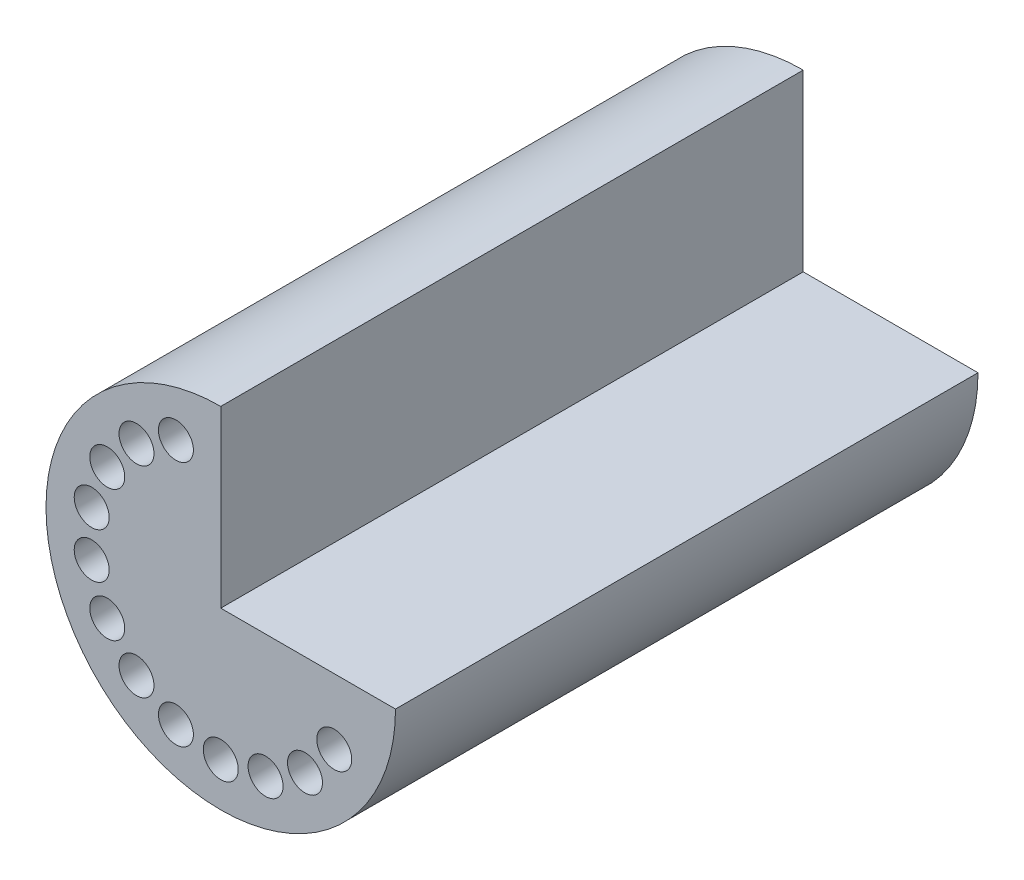
ISO-10303-21;
HEADER;
FILE_DESCRIPTION(('STEP AP214'),'2;1');
FILE_NAME('part.step','',(''),(''),'','','');
FILE_SCHEMA(('AUTOMOTIVE_DESIGN { 1 0 10303 214 1 1 1 1 }'));
ENDSEC;
DATA;
#1=APPLICATION_CONTEXT('core data for automotive mechanical design processes');
#2=APPLICATION_PROTOCOL_DEFINITION('international standard','automotive_design',2000,#1);
#3=PRODUCT_CONTEXT('',#1,'mechanical');
#4=PRODUCT('Part','Part','',(#3));
#5=PRODUCT_RELATED_PRODUCT_CATEGORY('part','',(#4));
#6=PRODUCT_DEFINITION_FORMATION('','',#4);
#7=PRODUCT_DEFINITION_CONTEXT('part definition',#1,'design');
#8=PRODUCT_DEFINITION('design','',#6,#7);
#9=PRODUCT_DEFINITION_SHAPE('','',#8);
#10=(LENGTH_UNIT() NAMED_UNIT(*) SI_UNIT(.MILLI.,.METRE.));
#11=(NAMED_UNIT(*) PLANE_ANGLE_UNIT() SI_UNIT($,.RADIAN.));
#12=(NAMED_UNIT(*) SI_UNIT($,.STERADIAN.) SOLID_ANGLE_UNIT());
#13=UNCERTAINTY_MEASURE_WITH_UNIT(LENGTH_MEASURE(1.E-05),#10,'distance_accuracy_value','');
#14=(GEOMETRIC_REPRESENTATION_CONTEXT(3) GLOBAL_UNCERTAINTY_ASSIGNED_CONTEXT((#13)) GLOBAL_UNIT_ASSIGNED_CONTEXT((#10,
#11,#12)) REPRESENTATION_CONTEXT('',''));
#15=CARTESIAN_POINT('',(0.,0.,0.));
#16=DIRECTION('',(0.,0.,1.));
#17=DIRECTION('',(1.,0.,0.));
#18=AXIS2_PLACEMENT_3D('',#15,#16,#17);
#19=CARTESIAN_POINT('',(0.,0.,-500.));
#20=DIRECTION('',(0.,0.,1.));
#21=DIRECTION('',(1.,0.,0.));
#22=AXIS2_PLACEMENT_3D('',#19,#20,#21);
#23=CYLINDRICAL_SURFACE('',#22,150.);
#24=CARTESIAN_POINT('',(0.,0.,0.));
#25=DIRECTION('',(0.,0.,1.));
#26=DIRECTION('',(1.,0.,0.));
#27=AXIS2_PLACEMENT_3D('',#24,#25,#26);
#28=CIRCLE('',#27,150.);
#29=CARTESIAN_POINT('',(0.,150.,0.));
#30=VERTEX_POINT('',#29);
#31=CARTESIAN_POINT('',(150.,0.,0.));
#32=VERTEX_POINT('',#31);
#33=EDGE_CURVE('E37',#30,#32,#28,.T.);
#34=ORIENTED_EDGE('',*,*,#33,.F.);
#35=DIRECTION('',(0.,0.,1.));
#36=VECTOR('',#35,1.);
#37=CARTESIAN_POINT('',(0.,150.,-500.));
#38=LINE('',#37,#36);
#39=CARTESIAN_POINT('',(0.,150.,-500.));
#40=VERTEX_POINT('',#39);
#41=EDGE_CURVE('E64',#40,#30,#38,.T.);
#42=ORIENTED_EDGE('',*,*,#41,.F.);
#43=CARTESIAN_POINT('',(0.,0.,-500.));
#44=DIRECTION('',(0.,0.,1.));
#45=DIRECTION('',(1.,0.,0.));
#46=AXIS2_PLACEMENT_3D('',#43,#44,#45);
#47=CIRCLE('',#46,150.);
#48=CARTESIAN_POINT('',(150.,0.,-500.));
#49=VERTEX_POINT('',#48);
#50=EDGE_CURVE('E11',#40,#49,#47,.T.);
#51=ORIENTED_EDGE('',*,*,#50,.T.);
#52=DIRECTION('',(0.,0.,1.));
#53=VECTOR('',#52,1.);
#54=CARTESIAN_POINT('',(150.,0.,-500.));
#55=LINE('',#54,#53);
#56=EDGE_CURVE('E70',#49,#32,#55,.T.);
#57=ORIENTED_EDGE('',*,*,#56,.T.);
#58=EDGE_LOOP('',(#34,#42,#51,#57));
#59=FACE_BOUND('',#58,.T.);
#60=ADVANCED_FACE('F34',(#59),#23,.T.);
#61=CARTESIAN_POINT('',(0.,0.,-500.));
#62=DIRECTION('',(0.,0.,1.));
#63=DIRECTION('',(1.,0.,0.));
#64=AXIS2_PLACEMENT_3D('',#61,#62,#63);
#65=PLANE('',#64);
#66=CARTESIAN_POINT('',(97.4278579257496,-56.2499999999996,-500.));
#67=DIRECTION('',(0.,0.,1.));
#68=DIRECTION('',(-0.766044443118971,-0.642787609686547,0.));
#69=AXIS2_PLACEMENT_3D('',#66,#67,#68);
#70=CIRCLE('',#69,15.);
#71=CARTESIAN_POINT('',(85.937191278965,-65.8918141452978,-500.));
#72=VERTEX_POINT('',#71);
#73=EDGE_CURVE('E331',#72,#72,#70,.T.);
#74=ORIENTED_EDGE('',*,*,#73,.T.);
#75=EDGE_LOOP('',(#74));
#76=FACE_BOUND('',#75,.T.);
#77=CARTESIAN_POINT('',(72.3136060897359,-86.1799998508848,-500.));
#78=DIRECTION('',(0.,0.,1.));
#79=DIRECTION('',(-0.939692620785905,-0.342020143325677,0.));
#80=AXIS2_PLACEMENT_3D('',#77,#78,#79);
#81=CIRCLE('',#80,15.);
#82=CARTESIAN_POINT('',(58.2182167779474,-91.31030200077,-500.));
#83=VERTEX_POINT('',#82);
#84=EDGE_CURVE('E325',#83,#83,#81,.T.);
#85=ORIENTED_EDGE('',*,*,#84,.T.);
#86=EDGE_LOOP('',(#85));
#87=FACE_BOUND('',#86,.T.);
#88=CARTESIAN_POINT('',(38.4772661241371,-105.715419838415,-500.));
#89=DIRECTION('',(0.,0.,1.));
#90=DIRECTION('',(-1.,0.,0.));
#91=AXIS2_PLACEMENT_3D('',#88,#89,#90);
#92=CIRCLE('',#91,15.);
#93=CARTESIAN_POINT('',(23.4772661241371,-105.715419838415,-500.));
#94=VERTEX_POINT('',#93);
#95=EDGE_CURVE('E319',#94,#94,#92,.T.);
#96=ORIENTED_EDGE('',*,*,#95,.T.);
#97=EDGE_LOOP('',(#96));
#98=FACE_BOUND('',#97,.T.);
#99=CARTESIAN_POINT('',(1.45716771982052E-13,-112.5,-500.));
#100=DIRECTION('',(0.,0.,1.));
#101=DIRECTION('',(-0.939692620785911,0.342020143325662,0.));
#102=AXIS2_PLACEMENT_3D('',#99,#100,#101);
#103=CIRCLE('',#102,15.);
#104=CARTESIAN_POINT('',(-14.0953893117885,-107.369697850115,-500.));
#105=VERTEX_POINT('',#104);
#106=EDGE_CURVE('E313',#105,#105,#103,.T.);
#107=ORIENTED_EDGE('',*,*,#106,.T.);
#108=EDGE_LOOP('',(#107));
#109=FACE_BOUND('',#108,.T.);
#110=CARTESIAN_POINT('',(-38.4772661241377,-105.715419838415,-500.));
#111=DIRECTION('',(0.,0.,1.));
#112=DIRECTION('',(-0.766044443118982,0.642787609686534,0.));
#113=AXIS2_PLACEMENT_3D('',#110,#111,#112);
#114=CIRCLE('',#113,15.);
#115=CARTESIAN_POINT('',(-49.9679327709224,-96.0736056931167,-500.));
#116=VERTEX_POINT('',#115);
#117=EDGE_CURVE('E307',#116,#116,#114,.T.);
#118=ORIENTED_EDGE('',*,*,#117,.T.);
#119=EDGE_LOOP('',(#118));
#120=FACE_BOUND('',#119,.T.);
#121=CARTESIAN_POINT('',(-72.3136060897357,-86.179999850885,-500.));
#122=DIRECTION('',(0.,0.,1.));
#123=DIRECTION('',(-0.500000000000005,0.866025403784436,0.));
#124=AXIS2_PLACEMENT_3D('',#121,#122,#123);
#125=CIRCLE('',#124,15.);
#126=CARTESIAN_POINT('',(-79.8136060897358,-73.1896187941185,-500.));
#127=VERTEX_POINT('',#126);
#128=EDGE_CURVE('E301',#127,#127,#125,.T.);
#129=ORIENTED_EDGE('',*,*,#128,.T.);
#130=EDGE_LOOP('',(#129));
#131=FACE_BOUND('',#130,.T.);
#132=CARTESIAN_POINT('',(-97.4278579257494,-56.2499999999999,-500.));
#133=DIRECTION('',(0.,0.,1.));
#134=DIRECTION('',(-0.173648177666935,0.984807753012207,0.));
#135=AXIS2_PLACEMENT_3D('',#132,#133,#134);
#136=CIRCLE('',#135,15.);
#137=CARTESIAN_POINT('',(-100.032580590753,-41.4778837048168,-500.));
#138=VERTEX_POINT('',#137);
#139=EDGE_CURVE('E295',#138,#138,#136,.T.);
#140=ORIENTED_EDGE('',*,*,#139,.T.);
#141=EDGE_LOOP('',(#140));
#142=FACE_BOUND('',#141,.T.);
#143=CARTESIAN_POINT('',(-110.790872213873,-19.5354199875294,-500.));
#144=DIRECTION('',(0.,0.,1.));
#145=DIRECTION('',(0.173648177666927,0.984807753012209,0.));
#146=AXIS2_PLACEMENT_3D('',#143,#144,#145);
#147=CIRCLE('',#146,15.);
#148=CARTESIAN_POINT('',(-108.18614954887,-4.76330369234627,-500.));
#149=VERTEX_POINT('',#148);
#150=EDGE_CURVE('E289',#149,#149,#147,.T.);
#151=ORIENTED_EDGE('',*,*,#150,.T.);
#152=EDGE_LOOP('',(#151));
#153=FACE_BOUND('',#152,.T.);
#154=CARTESIAN_POINT('',(-110.790872213873,19.53541998753,-500.));
#155=DIRECTION('',(0.,0.,1.));
#156=DIRECTION('',(0.499999999999998,0.86602540378444,0.));
#157=AXIS2_PLACEMENT_3D('',#154,#155,#156);
#158=CIRCLE('',#157,15.);
#159=CARTESIAN_POINT('',(-103.290872213873,32.5258010442966,-500.));
#160=VERTEX_POINT('',#159);
#161=EDGE_CURVE('E283',#160,#160,#158,.T.);
#162=ORIENTED_EDGE('',*,*,#161,.T.);
#163=EDGE_LOOP('',(#162));
#164=FACE_BOUND('',#163,.T.);
#165=CARTESIAN_POINT('',(-97.4278579257491,56.2500000000004,-500.));
#166=DIRECTION('',(0.,0.,1.));
#167=DIRECTION('',(0.766044443118977,0.642787609686541,0.));
#168=AXIS2_PLACEMENT_3D('',#165,#166,#167);
#169=CIRCLE('',#168,15.);
#170=CARTESIAN_POINT('',(-85.9371912789644,65.8918141452985,-500.));
#171=VERTEX_POINT('',#170);
#172=EDGE_CURVE('E277',#171,#171,#169,.T.);
#173=ORIENTED_EDGE('',*,*,#172,.T.);
#174=EDGE_LOOP('',(#173));
#175=FACE_BOUND('',#174,.T.);
#176=CARTESIAN_POINT('',(-72.3136060897352,86.1799998508854,-500.));
#177=DIRECTION('',(0.,0.,1.));
#178=DIRECTION('',(0.939692620785908,0.34202014332567,0.));
#179=AXIS2_PLACEMENT_3D('',#176,#177,#178);
#180=CIRCLE('',#179,15.);
#181=CARTESIAN_POINT('',(-58.2182167779466,91.3103020007704,-500.));
#182=VERTEX_POINT('',#181);
#183=EDGE_CURVE('E267',#182,#182,#180,.T.);
#184=ORIENTED_EDGE('',*,*,#183,.T.);
#185=EDGE_LOOP('',(#184));
#186=FACE_BOUND('',#185,.T.);
#187=CARTESIAN_POINT('',(-38.4772661241371,105.715419838415,-500.));
#188=DIRECTION('',(0.,0.,1.));
#189=DIRECTION('',(1.,0.,0.));
#190=AXIS2_PLACEMENT_3D('',#187,#188,#189);
#191=CIRCLE('',#190,15.);
#192=CARTESIAN_POINT('',(-23.4772661241371,105.715419838415,-500.));
#193=VERTEX_POINT('',#192);
#194=EDGE_CURVE('E87',#193,#193,#191,.T.);
#195=ORIENTED_EDGE('',*,*,#194,.T.);
#196=EDGE_LOOP('',(#195));
#197=FACE_BOUND('',#196,.T.);
#198=ORIENTED_EDGE('',*,*,#50,.F.);
#199=DIRECTION('',(0.,-1.,0.));
#200=VECTOR('',#199,1.);
#201=CARTESIAN_POINT('',(0.,0.,-500.));
#202=LINE('',#201,#200);
#203=CARTESIAN_POINT('',(0.,0.,-500.));
#204=VERTEX_POINT('',#203);
#205=EDGE_CURVE('E54',#40,#204,#202,.T.);
#206=ORIENTED_EDGE('',*,*,#205,.T.);
#207=DIRECTION('',(1.,0.,0.));
#208=VECTOR('',#207,1.);
#209=CARTESIAN_POINT('',(0.,0.,-500.));
#210=LINE('',#209,#208);
#211=EDGE_CURVE('E71',#204,#49,#210,.T.);
#212=ORIENTED_EDGE('',*,*,#211,.T.);
#213=EDGE_LOOP('',(#198,#206,#212));
#214=FACE_BOUND('',#213,.T.);
#215=ADVANCED_FACE('F79',(#76,#87,#98,#109,#120,#131,#142,#153,#164,#175,#186,#197,#214),#65,.F.);
#216=CARTESIAN_POINT('',(0.,0.,0.));
#217=DIRECTION('',(0.,0.,1.));
#218=DIRECTION('',(1.,0.,0.));
#219=AXIS2_PLACEMENT_3D('',#216,#217,#218);
#220=PLANE('',#219);
#221=CARTESIAN_POINT('',(97.4278579257496,-56.2499999999996,0.));
#222=DIRECTION('',(0.,0.,1.));
#223=DIRECTION('',(-0.766044443118971,-0.642787609686547,0.));
#224=AXIS2_PLACEMENT_3D('',#221,#222,#223);
#225=CIRCLE('',#224,15.);
#226=CARTESIAN_POINT('',(85.937191278965,-65.8918141452978,0.));
#227=VERTEX_POINT('',#226);
#228=EDGE_CURVE('E328',#227,#227,#225,.T.);
#229=ORIENTED_EDGE('',*,*,#228,.F.);
#230=EDGE_LOOP('',(#229));
#231=FACE_BOUND('',#230,.T.);
#232=CARTESIAN_POINT('',(72.3136060897359,-86.1799998508848,0.));
#233=DIRECTION('',(0.,0.,1.));
#234=DIRECTION('',(-0.939692620785905,-0.342020143325677,0.));
#235=AXIS2_PLACEMENT_3D('',#232,#233,#234);
#236=CIRCLE('',#235,15.);
#237=CARTESIAN_POINT('',(58.2182167779474,-91.31030200077,0.));
#238=VERTEX_POINT('',#237);
#239=EDGE_CURVE('E322',#238,#238,#236,.T.);
#240=ORIENTED_EDGE('',*,*,#239,.F.);
#241=EDGE_LOOP('',(#240));
#242=FACE_BOUND('',#241,.T.);
#243=CARTESIAN_POINT('',(38.4772661241371,-105.715419838415,0.));
#244=DIRECTION('',(0.,0.,1.));
#245=DIRECTION('',(-1.,0.,0.));
#246=AXIS2_PLACEMENT_3D('',#243,#244,#245);
#247=CIRCLE('',#246,15.);
#248=CARTESIAN_POINT('',(23.4772661241371,-105.715419838415,0.));
#249=VERTEX_POINT('',#248);
#250=EDGE_CURVE('E316',#249,#249,#247,.T.);
#251=ORIENTED_EDGE('',*,*,#250,.F.);
#252=EDGE_LOOP('',(#251));
#253=FACE_BOUND('',#252,.T.);
#254=CARTESIAN_POINT('',(1.45716771982052E-13,-112.5,0.));
#255=DIRECTION('',(0.,0.,1.));
#256=DIRECTION('',(-0.939692620785911,0.342020143325662,0.));
#257=AXIS2_PLACEMENT_3D('',#254,#255,#256);
#258=CIRCLE('',#257,15.);
#259=CARTESIAN_POINT('',(-14.0953893117885,-107.369697850115,0.));
#260=VERTEX_POINT('',#259);
#261=EDGE_CURVE('E310',#260,#260,#258,.T.);
#262=ORIENTED_EDGE('',*,*,#261,.F.);
#263=EDGE_LOOP('',(#262));
#264=FACE_BOUND('',#263,.T.);
#265=CARTESIAN_POINT('',(-38.4772661241377,-105.715419838415,0.));
#266=DIRECTION('',(0.,0.,1.));
#267=DIRECTION('',(-0.766044443118982,0.642787609686534,0.));
#268=AXIS2_PLACEMENT_3D('',#265,#266,#267);
#269=CIRCLE('',#268,15.);
#270=CARTESIAN_POINT('',(-49.9679327709224,-96.0736056931167,0.));
#271=VERTEX_POINT('',#270);
#272=EDGE_CURVE('E304',#271,#271,#269,.T.);
#273=ORIENTED_EDGE('',*,*,#272,.F.);
#274=EDGE_LOOP('',(#273));
#275=FACE_BOUND('',#274,.T.);
#276=CARTESIAN_POINT('',(-72.3136060897357,-86.179999850885,0.));
#277=DIRECTION('',(0.,0.,1.));
#278=DIRECTION('',(-0.500000000000005,0.866025403784436,0.));
#279=AXIS2_PLACEMENT_3D('',#276,#277,#278);
#280=CIRCLE('',#279,15.);
#281=CARTESIAN_POINT('',(-79.8136060897358,-73.1896187941185,0.));
#282=VERTEX_POINT('',#281);
#283=EDGE_CURVE('E298',#282,#282,#280,.T.);
#284=ORIENTED_EDGE('',*,*,#283,.F.);
#285=EDGE_LOOP('',(#284));
#286=FACE_BOUND('',#285,.T.);
#287=CARTESIAN_POINT('',(-97.4278579257494,-56.2499999999999,0.));
#288=DIRECTION('',(0.,0.,1.));
#289=DIRECTION('',(-0.173648177666935,0.984807753012207,0.));
#290=AXIS2_PLACEMENT_3D('',#287,#288,#289);
#291=CIRCLE('',#290,15.);
#292=CARTESIAN_POINT('',(-100.032580590753,-41.4778837048168,0.));
#293=VERTEX_POINT('',#292);
#294=EDGE_CURVE('E292',#293,#293,#291,.T.);
#295=ORIENTED_EDGE('',*,*,#294,.F.);
#296=EDGE_LOOP('',(#295));
#297=FACE_BOUND('',#296,.T.);
#298=CARTESIAN_POINT('',(-110.790872213873,-19.5354199875294,0.));
#299=DIRECTION('',(0.,0.,1.));
#300=DIRECTION('',(0.173648177666927,0.984807753012209,0.));
#301=AXIS2_PLACEMENT_3D('',#298,#299,#300);
#302=CIRCLE('',#301,15.);
#303=CARTESIAN_POINT('',(-108.18614954887,-4.76330369234627,0.));
#304=VERTEX_POINT('',#303);
#305=EDGE_CURVE('E286',#304,#304,#302,.T.);
#306=ORIENTED_EDGE('',*,*,#305,.F.);
#307=EDGE_LOOP('',(#306));
#308=FACE_BOUND('',#307,.T.);
#309=CARTESIAN_POINT('',(-110.790872213873,19.53541998753,0.));
#310=DIRECTION('',(0.,0.,1.));
#311=DIRECTION('',(0.499999999999998,0.86602540378444,0.));
#312=AXIS2_PLACEMENT_3D('',#309,#310,#311);
#313=CIRCLE('',#312,15.);
#314=CARTESIAN_POINT('',(-103.290872213873,32.5258010442966,0.));
#315=VERTEX_POINT('',#314);
#316=EDGE_CURVE('E280',#315,#315,#313,.T.);
#317=ORIENTED_EDGE('',*,*,#316,.F.);
#318=EDGE_LOOP('',(#317));
#319=FACE_BOUND('',#318,.T.);
#320=CARTESIAN_POINT('',(-97.4278579257491,56.2500000000004,0.));
#321=DIRECTION('',(0.,0.,1.));
#322=DIRECTION('',(0.766044443118977,0.642787609686541,0.));
#323=AXIS2_PLACEMENT_3D('',#320,#321,#322);
#324=CIRCLE('',#323,15.);
#325=CARTESIAN_POINT('',(-85.9371912789644,65.8918141452985,0.));
#326=VERTEX_POINT('',#325);
#327=EDGE_CURVE('E272',#326,#326,#324,.T.);
#328=ORIENTED_EDGE('',*,*,#327,.F.);
#329=EDGE_LOOP('',(#328));
#330=FACE_BOUND('',#329,.T.);
#331=CARTESIAN_POINT('',(-72.3136060897352,86.1799998508854,0.));
#332=DIRECTION('',(0.,0.,1.));
#333=DIRECTION('',(0.939692620785908,0.34202014332567,0.));
#334=AXIS2_PLACEMENT_3D('',#331,#332,#333);
#335=CIRCLE('',#334,15.);
#336=CARTESIAN_POINT('',(-58.2182167779466,91.3103020007704,0.));
#337=VERTEX_POINT('',#336);
#338=EDGE_CURVE('E265',#337,#337,#335,.T.);
#339=ORIENTED_EDGE('',*,*,#338,.F.);
#340=EDGE_LOOP('',(#339));
#341=FACE_BOUND('',#340,.T.);
#342=CARTESIAN_POINT('',(-38.4772661241371,105.715419838415,0.));
#343=DIRECTION('',(0.,0.,1.));
#344=DIRECTION('',(1.,0.,0.));
#345=AXIS2_PLACEMENT_3D('',#342,#343,#344);
#346=CIRCLE('',#345,15.);
#347=CARTESIAN_POINT('',(-23.4772661241371,105.715419838415,0.));
#348=VERTEX_POINT('',#347);
#349=EDGE_CURVE('E84',#348,#348,#346,.T.);
#350=ORIENTED_EDGE('',*,*,#349,.F.);
#351=EDGE_LOOP('',(#350));
#352=FACE_BOUND('',#351,.T.);
#353=DIRECTION('',(0.,-1.,0.));
#354=VECTOR('',#353,1.);
#355=CARTESIAN_POINT('',(0.,0.,0.));
#356=LINE('',#355,#354);
#357=CARTESIAN_POINT('',(0.,0.,0.));
#358=VERTEX_POINT('',#357);
#359=EDGE_CURVE('E48',#30,#358,#356,.T.);
#360=ORIENTED_EDGE('',*,*,#359,.F.);
#361=ORIENTED_EDGE('',*,*,#33,.T.);
#362=DIRECTION('',(1.,0.,0.));
#363=VECTOR('',#362,1.);
#364=CARTESIAN_POINT('',(0.,0.,0.));
#365=LINE('',#364,#363);
#366=EDGE_CURVE('E80',#358,#32,#365,.T.);
#367=ORIENTED_EDGE('',*,*,#366,.F.);
#368=EDGE_LOOP('',(#360,#361,#367));
#369=FACE_BOUND('',#368,.T.);
#370=ADVANCED_FACE('F94',(#231,#242,#253,#264,#275,#286,#297,#308,#319,#330,#341,#352,#369),
#220,.T.);
#371=CARTESIAN_POINT('',(0.,0.,-500.));
#372=DIRECTION('',(-1.,0.,0.));
#373=DIRECTION('',(0.,0.,1.));
#374=AXIS2_PLACEMENT_3D('',#371,#372,#373);
#375=PLANE('',#374);
#376=ORIENTED_EDGE('',*,*,#359,.T.);
#377=DIRECTION('',(0.,0.,1.));
#378=VECTOR('',#377,1.);
#379=CARTESIAN_POINT('',(0.,0.,-500.));
#380=LINE('',#379,#378);
#381=EDGE_CURVE('E65',#204,#358,#380,.T.);
#382=ORIENTED_EDGE('',*,*,#381,.F.);
#383=ORIENTED_EDGE('',*,*,#205,.F.);
#384=ORIENTED_EDGE('',*,*,#41,.T.);
#385=EDGE_LOOP('',(#376,#382,#383,#384));
#386=FACE_BOUND('',#385,.T.);
#387=ADVANCED_FACE('F67',(#386),#375,.F.);
#388=CARTESIAN_POINT('',(0.,0.,-500.));
#389=DIRECTION('',(0.,-1.,0.));
#390=DIRECTION('',(0.,0.,-1.));
#391=AXIS2_PLACEMENT_3D('',#388,#389,#390);
#392=PLANE('',#391);
#393=ORIENTED_EDGE('',*,*,#366,.T.);
#394=ORIENTED_EDGE('',*,*,#56,.F.);
#395=ORIENTED_EDGE('',*,*,#211,.F.);
#396=ORIENTED_EDGE('',*,*,#381,.T.);
#397=EDGE_LOOP('',(#393,#394,#395,#396));
#398=FACE_BOUND('',#397,.T.);
#399=ADVANCED_FACE('F74',(#398),#392,.F.);
#400=CARTESIAN_POINT('',(-38.4772661241371,105.715419838415,-500.));
#401=DIRECTION('',(0.,0.,1.));
#402=DIRECTION('',(1.,0.,0.));
#403=AXIS2_PLACEMENT_3D('',#400,#401,#402);
#404=CYLINDRICAL_SURFACE('',#403,15.);
#405=ORIENTED_EDGE('',*,*,#194,.F.);
#406=EDGE_LOOP('',(#405));
#407=FACE_BOUND('',#406,.T.);
#408=ORIENTED_EDGE('',*,*,#349,.T.);
#409=EDGE_LOOP('',(#408));
#410=FACE_BOUND('',#409,.T.);
#411=ADVANCED_FACE('F120',(#407,#410),#404,.F.);
#412=CARTESIAN_POINT('',(-72.3136060897352,86.1799998508854,-500.));
#413=DIRECTION('',(0.,0.,1.));
#414=DIRECTION('',(0.939692620785908,0.34202014332567,0.));
#415=AXIS2_PLACEMENT_3D('',#412,#413,#414);
#416=CYLINDRICAL_SURFACE('',#415,15.);
#417=ORIENTED_EDGE('',*,*,#183,.F.);
#418=EDGE_LOOP('',(#417));
#419=FACE_BOUND('',#418,.T.);
#420=ORIENTED_EDGE('',*,*,#338,.T.);
#421=EDGE_LOOP('',(#420));
#422=FACE_BOUND('',#421,.T.);
#423=ADVANCED_FACE('F129',(#419,#422),#416,.F.);
#424=CARTESIAN_POINT('',(-97.4278579257491,56.2500000000004,-500.));
#425=DIRECTION('',(0.,0.,1.));
#426=DIRECTION('',(0.766044443118977,0.642787609686541,0.));
#427=AXIS2_PLACEMENT_3D('',#424,#425,#426);
#428=CYLINDRICAL_SURFACE('',#427,15.);
#429=ORIENTED_EDGE('',*,*,#172,.F.);
#430=EDGE_LOOP('',(#429));
#431=FACE_BOUND('',#430,.T.);
#432=ORIENTED_EDGE('',*,*,#327,.T.);
#433=EDGE_LOOP('',(#432));
#434=FACE_BOUND('',#433,.T.);
#435=ADVANCED_FACE('F134',(#431,#434),#428,.F.);
#436=CARTESIAN_POINT('',(-110.790872213873,19.53541998753,-500.));
#437=DIRECTION('',(0.,0.,1.));
#438=DIRECTION('',(0.499999999999998,0.86602540378444,0.));
#439=AXIS2_PLACEMENT_3D('',#436,#437,#438);
#440=CYLINDRICAL_SURFACE('',#439,15.);
#441=ORIENTED_EDGE('',*,*,#161,.F.);
#442=EDGE_LOOP('',(#441));
#443=FACE_BOUND('',#442,.T.);
#444=ORIENTED_EDGE('',*,*,#316,.T.);
#445=EDGE_LOOP('',(#444));
#446=FACE_BOUND('',#445,.T.);
#447=ADVANCED_FACE('F144',(#443,#446),#440,.F.);
#448=CARTESIAN_POINT('',(-110.790872213873,-19.5354199875294,-500.));
#449=DIRECTION('',(0.,0.,1.));
#450=DIRECTION('',(0.173648177666927,0.984807753012209,0.));
#451=AXIS2_PLACEMENT_3D('',#448,#449,#450);
#452=CYLINDRICAL_SURFACE('',#451,15.);
#453=ORIENTED_EDGE('',*,*,#150,.F.);
#454=EDGE_LOOP('',(#453));
#455=FACE_BOUND('',#454,.T.);
#456=ORIENTED_EDGE('',*,*,#305,.T.);
#457=EDGE_LOOP('',(#456));
#458=FACE_BOUND('',#457,.T.);
#459=ADVANCED_FACE('F154',(#455,#458),#452,.F.);
#460=CARTESIAN_POINT('',(-97.4278579257494,-56.2499999999999,-500.));
#461=DIRECTION('',(0.,0.,1.));
#462=DIRECTION('',(-0.173648177666935,0.984807753012207,0.));
#463=AXIS2_PLACEMENT_3D('',#460,#461,#462);
#464=CYLINDRICAL_SURFACE('',#463,15.);
#465=ORIENTED_EDGE('',*,*,#139,.F.);
#466=EDGE_LOOP('',(#465));
#467=FACE_BOUND('',#466,.T.);
#468=ORIENTED_EDGE('',*,*,#294,.T.);
#469=EDGE_LOOP('',(#468));
#470=FACE_BOUND('',#469,.T.);
#471=ADVANCED_FACE('F164',(#467,#470),#464,.F.);
#472=CARTESIAN_POINT('',(-72.3136060897357,-86.179999850885,-500.));
#473=DIRECTION('',(0.,0.,1.));
#474=DIRECTION('',(-0.500000000000005,0.866025403784436,0.));
#475=AXIS2_PLACEMENT_3D('',#472,#473,#474);
#476=CYLINDRICAL_SURFACE('',#475,15.);
#477=ORIENTED_EDGE('',*,*,#128,.F.);
#478=EDGE_LOOP('',(#477));
#479=FACE_BOUND('',#478,.T.);
#480=ORIENTED_EDGE('',*,*,#283,.T.);
#481=EDGE_LOOP('',(#480));
#482=FACE_BOUND('',#481,.T.);
#483=ADVANCED_FACE('F174',(#479,#482),#476,.F.);
#484=CARTESIAN_POINT('',(-38.4772661241377,-105.715419838415,-500.));
#485=DIRECTION('',(0.,0.,1.));
#486=DIRECTION('',(-0.766044443118982,0.642787609686534,0.));
#487=AXIS2_PLACEMENT_3D('',#484,#485,#486);
#488=CYLINDRICAL_SURFACE('',#487,15.);
#489=ORIENTED_EDGE('',*,*,#117,.F.);
#490=EDGE_LOOP('',(#489));
#491=FACE_BOUND('',#490,.T.);
#492=ORIENTED_EDGE('',*,*,#272,.T.);
#493=EDGE_LOOP('',(#492));
#494=FACE_BOUND('',#493,.T.);
#495=ADVANCED_FACE('F184',(#491,#494),#488,.F.);
#496=CARTESIAN_POINT('',(1.45716771982052E-13,-112.5,-500.));
#497=DIRECTION('',(0.,0.,1.));
#498=DIRECTION('',(-0.939692620785911,0.342020143325662,0.));
#499=AXIS2_PLACEMENT_3D('',#496,#497,#498);
#500=CYLINDRICAL_SURFACE('',#499,15.);
#501=ORIENTED_EDGE('',*,*,#106,.F.);
#502=EDGE_LOOP('',(#501));
#503=FACE_BOUND('',#502,.T.);
#504=ORIENTED_EDGE('',*,*,#261,.T.);
#505=EDGE_LOOP('',(#504));
#506=FACE_BOUND('',#505,.T.);
#507=ADVANCED_FACE('F194',(#503,#506),#500,.F.);
#508=CARTESIAN_POINT('',(38.4772661241371,-105.715419838415,-500.));
#509=DIRECTION('',(0.,0.,1.));
#510=DIRECTION('',(-1.,0.,0.));
#511=AXIS2_PLACEMENT_3D('',#508,#509,#510);
#512=CYLINDRICAL_SURFACE('',#511,15.);
#513=ORIENTED_EDGE('',*,*,#95,.F.);
#514=EDGE_LOOP('',(#513));
#515=FACE_BOUND('',#514,.T.);
#516=ORIENTED_EDGE('',*,*,#250,.T.);
#517=EDGE_LOOP('',(#516));
#518=FACE_BOUND('',#517,.T.);
#519=ADVANCED_FACE('F204',(#515,#518),#512,.F.);
#520=CARTESIAN_POINT('',(72.3136060897359,-86.1799998508848,-500.));
#521=DIRECTION('',(0.,0.,1.));
#522=DIRECTION('',(-0.939692620785905,-0.342020143325677,0.));
#523=AXIS2_PLACEMENT_3D('',#520,#521,#522);
#524=CYLINDRICAL_SURFACE('',#523,15.);
#525=ORIENTED_EDGE('',*,*,#84,.F.);
#526=EDGE_LOOP('',(#525));
#527=FACE_BOUND('',#526,.T.);
#528=ORIENTED_EDGE('',*,*,#239,.T.);
#529=EDGE_LOOP('',(#528));
#530=FACE_BOUND('',#529,.T.);
#531=ADVANCED_FACE('F214',(#527,#530),#524,.F.);
#532=CARTESIAN_POINT('',(97.4278579257496,-56.2499999999996,-500.));
#533=DIRECTION('',(0.,0.,1.));
#534=DIRECTION('',(-0.766044443118971,-0.642787609686547,0.));
#535=AXIS2_PLACEMENT_3D('',#532,#533,#534);
#536=CYLINDRICAL_SURFACE('',#535,15.);
#537=ORIENTED_EDGE('',*,*,#73,.F.);
#538=EDGE_LOOP('',(#537));
#539=FACE_BOUND('',#538,.T.);
#540=ORIENTED_EDGE('',*,*,#228,.T.);
#541=EDGE_LOOP('',(#540));
#542=FACE_BOUND('',#541,.T.);
#543=ADVANCED_FACE('F224',(#539,#542),#536,.F.);
#544=CLOSED_SHELL('',(#60,#215,#370,#387,#399,#411,#423,#435,#447,#459,#471,#483,#495,#507,#519,
#531,#543));
#545=MANIFOLD_SOLID_BREP('B2',#544);
#546=ADVANCED_BREP_SHAPE_REPRESENTATION('',(#18,#545),#14);
#547=SHAPE_DEFINITION_REPRESENTATION(#9,#546);
ENDSEC;
END-ISO-10303-21;
